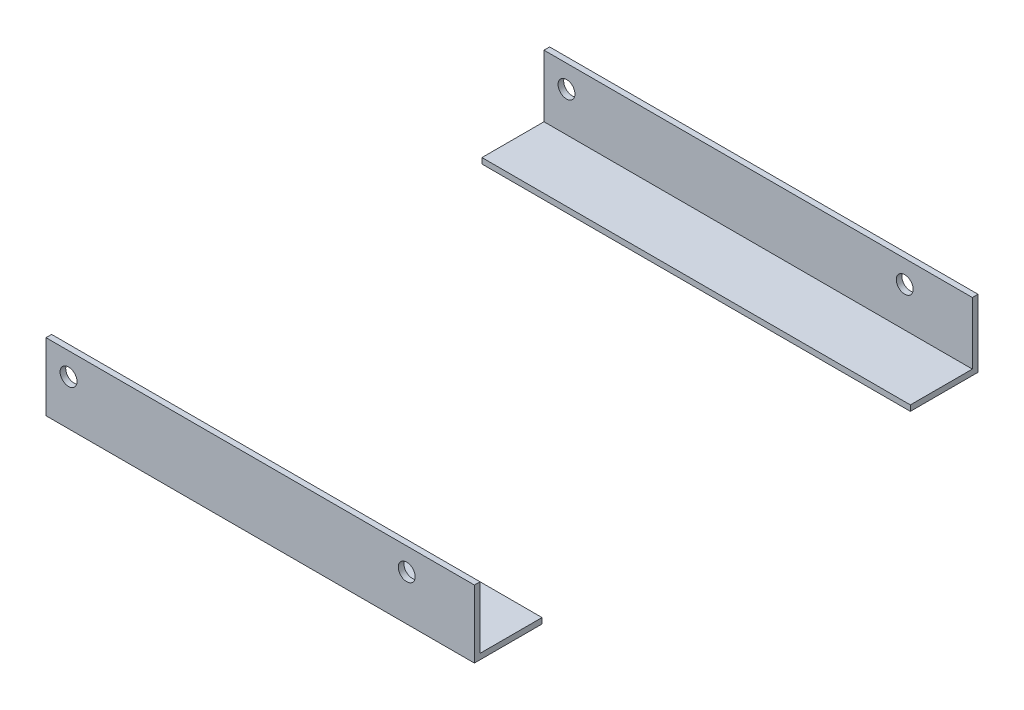
ISO-10303-21;
HEADER;
FILE_DESCRIPTION(('STEP AP214'),'2;1');
FILE_NAME('part.step','',(''),(''),'','','');
FILE_SCHEMA(('AUTOMOTIVE_DESIGN { 1 0 10303 214 1 1 1 1 }'));
ENDSEC;
DATA;
#1=APPLICATION_CONTEXT('core data for automotive mechanical design processes');
#2=APPLICATION_PROTOCOL_DEFINITION('international standard','automotive_design',2000,#1);
#3=PRODUCT_CONTEXT('',#1,'mechanical');
#4=PRODUCT('Part','Part','',(#3));
#5=PRODUCT_RELATED_PRODUCT_CATEGORY('part','',(#4));
#6=PRODUCT_DEFINITION_FORMATION('','',#4);
#7=PRODUCT_DEFINITION_CONTEXT('part definition',#1,'design');
#8=PRODUCT_DEFINITION('design','',#6,#7);
#9=PRODUCT_DEFINITION_SHAPE('','',#8);
#10=(LENGTH_UNIT() NAMED_UNIT(*) SI_UNIT(.MILLI.,.METRE.));
#11=(NAMED_UNIT(*) PLANE_ANGLE_UNIT() SI_UNIT($,.RADIAN.));
#12=(NAMED_UNIT(*) SI_UNIT($,.STERADIAN.) SOLID_ANGLE_UNIT());
#13=UNCERTAINTY_MEASURE_WITH_UNIT(LENGTH_MEASURE(1.E-05),#10,'distance_accuracy_value','');
#14=(GEOMETRIC_REPRESENTATION_CONTEXT(3) GLOBAL_UNCERTAINTY_ASSIGNED_CONTEXT((#13)) GLOBAL_UNIT_ASSIGNED_CONTEXT((#10,
#11,#12)) REPRESENTATION_CONTEXT('',''));
#15=CARTESIAN_POINT('',(0.,0.,0.));
#16=DIRECTION('',(0.,0.,1.));
#17=DIRECTION('',(1.,0.,0.));
#18=AXIS2_PLACEMENT_3D('',#15,#16,#17);
#19=CARTESIAN_POINT('',(-241.3,3.175,141.8336));
#20=DIRECTION('',(0.,0.,-1.));
#21=DIRECTION('',(-1.,0.,0.));
#22=AXIS2_PLACEMENT_3D('',#19,#20,#21);
#23=PLANE('',#22);
#24=CARTESIAN_POINT('',(-228.6,28.575,141.8336));
#25=DIRECTION('',(0.,0.,-1.));
#26=DIRECTION('',(-1.,0.,0.));
#27=AXIS2_PLACEMENT_3D('',#24,#25,#26);
#28=CIRCLE('',#27,4.76250000000001);
#29=CARTESIAN_POINT('',(-223.8375,28.575,141.8336));
#30=VERTEX_POINT('',#29);
#31=EDGE_CURVE('E144',#30,#30,#28,.T.);
#32=ORIENTED_EDGE('',*,*,#31,.T.);
#33=EDGE_LOOP('',(#32));
#34=FACE_BOUND('',#33,.T.);
#35=CARTESIAN_POINT('',(-38.1,28.575,141.8336));
#36=DIRECTION('',(0.,0.,-1.));
#37=DIRECTION('',(-1.,0.,0.));
#38=AXIS2_PLACEMENT_3D('',#35,#36,#37);
#39=CIRCLE('',#38,4.7625);
#40=CARTESIAN_POINT('',(-33.3375,28.575,141.8336));
#41=VERTEX_POINT('',#40);
#42=EDGE_CURVE('E127',#41,#41,#39,.T.);
#43=ORIENTED_EDGE('',*,*,#42,.T.);
#44=EDGE_LOOP('',(#43));
#45=FACE_BOUND('',#44,.T.);
#46=DIRECTION('',(0.,1.,0.));
#47=VECTOR('',#46,1.);
#48=CARTESIAN_POINT('',(0.,3.175,141.8336));
#49=LINE('',#48,#47);
#50=CARTESIAN_POINT('',(0.,3.175,141.8336));
#51=VERTEX_POINT('',#50);
#52=CARTESIAN_POINT('',(0.,41.275,141.8336));
#53=VERTEX_POINT('',#52);
#54=EDGE_CURVE('E93',#51,#53,#49,.T.);
#55=ORIENTED_EDGE('',*,*,#54,.T.);
#56=DIRECTION('',(1.,0.,0.));
#57=VECTOR('',#56,1.);
#58=CARTESIAN_POINT('',(-241.3,41.275,141.8336));
#59=LINE('',#58,#57);
#60=CARTESIAN_POINT('',(-241.3,41.275,141.8336));
#61=VERTEX_POINT('',#60);
#62=EDGE_CURVE('E139',#61,#53,#59,.T.);
#63=ORIENTED_EDGE('',*,*,#62,.F.);
#64=DIRECTION('',(0.,1.,0.));
#65=VECTOR('',#64,1.);
#66=CARTESIAN_POINT('',(-241.3,3.175,141.8336));
#67=LINE('',#66,#65);
#68=CARTESIAN_POINT('',(-241.3,3.175,141.8336));
#69=VERTEX_POINT('',#68);
#70=EDGE_CURVE('E112',#69,#61,#67,.T.);
#71=ORIENTED_EDGE('',*,*,#70,.F.);
#72=DIRECTION('',(1.,0.,0.));
#73=VECTOR('',#72,1.);
#74=CARTESIAN_POINT('',(-241.3,3.175,141.8336));
#75=LINE('',#74,#73);
#76=EDGE_CURVE('E126',#69,#51,#75,.T.);
#77=ORIENTED_EDGE('',*,*,#76,.T.);
#78=EDGE_LOOP('',(#55,#63,#71,#77));
#79=FACE_BOUND('',#78,.T.);
#80=ADVANCED_FACE('F44',(#34,#45,#79),#23,.F.);
#81=CARTESIAN_POINT('',(-241.3,41.275,138.6586));
#82=DIRECTION('',(0.,1.,0.));
#83=DIRECTION('',(0.,0.,1.));
#84=AXIS2_PLACEMENT_3D('',#81,#82,#83);
#85=PLANE('',#84);
#86=DIRECTION('',(0.,0.,1.));
#87=VECTOR('',#86,1.);
#88=CARTESIAN_POINT('',(0.,41.275,138.6586));
#89=LINE('',#88,#87);
#90=CARTESIAN_POINT('',(0.,41.275,138.6586));
#91=VERTEX_POINT('',#90);
#92=EDGE_CURVE('E123',#91,#53,#89,.T.);
#93=ORIENTED_EDGE('',*,*,#92,.F.);
#94=DIRECTION('',(1.,0.,0.));
#95=VECTOR('',#94,1.);
#96=CARTESIAN_POINT('',(-241.3,41.275,138.6586));
#97=LINE('',#96,#95);
#98=CARTESIAN_POINT('',(-241.3,41.275,138.6586));
#99=VERTEX_POINT('',#98);
#100=EDGE_CURVE('E135',#99,#91,#97,.T.);
#101=ORIENTED_EDGE('',*,*,#100,.F.);
#102=DIRECTION('',(0.,0.,1.));
#103=VECTOR('',#102,1.);
#104=CARTESIAN_POINT('',(-241.3,41.275,138.6586));
#105=LINE('',#104,#103);
#106=EDGE_CURVE('E140',#99,#61,#105,.T.);
#107=ORIENTED_EDGE('',*,*,#106,.T.);
#108=ORIENTED_EDGE('',*,*,#62,.T.);
#109=EDGE_LOOP('',(#93,#101,#107,#108));
#110=FACE_BOUND('',#109,.T.);
#111=ADVANCED_FACE('F165',(#110),#85,.T.);
#112=CARTESIAN_POINT('',(-241.3,3.175,138.6586));
#113=DIRECTION('',(0.,0.,-1.));
#114=DIRECTION('',(-1.,0.,0.));
#115=AXIS2_PLACEMENT_3D('',#112,#113,#114);
#116=PLANE('',#115);
#117=CARTESIAN_POINT('',(-228.6,28.575,138.6586));
#118=DIRECTION('',(0.,0.,-1.));
#119=DIRECTION('',(-1.,0.,0.));
#120=AXIS2_PLACEMENT_3D('',#117,#118,#119);
#121=CIRCLE('',#120,4.76250000000001);
#122=CARTESIAN_POINT('',(-223.8375,28.575,138.6586));
#123=VERTEX_POINT('',#122);
#124=EDGE_CURVE('E116',#123,#123,#121,.T.);
#125=ORIENTED_EDGE('',*,*,#124,.F.);
#126=EDGE_LOOP('',(#125));
#127=FACE_BOUND('',#126,.T.);
#128=CARTESIAN_POINT('',(-38.1,28.575,138.6586));
#129=DIRECTION('',(0.,0.,-1.));
#130=DIRECTION('',(-1.,0.,0.));
#131=AXIS2_PLACEMENT_3D('',#128,#129,#130);
#132=CIRCLE('',#131,4.7625);
#133=CARTESIAN_POINT('',(-33.3375,28.575,138.6586));
#134=VERTEX_POINT('',#133);
#135=EDGE_CURVE('E48',#134,#134,#132,.T.);
#136=ORIENTED_EDGE('',*,*,#135,.F.);
#137=EDGE_LOOP('',(#136));
#138=FACE_BOUND('',#137,.T.);
#139=DIRECTION('',(0.,1.,0.));
#140=VECTOR('',#139,1.);
#141=CARTESIAN_POINT('',(0.,3.175,138.6586));
#142=LINE('',#141,#140);
#143=CARTESIAN_POINT('',(0.,6.35,138.6586));
#144=VERTEX_POINT('',#143);
#145=EDGE_CURVE('E63',#144,#91,#142,.T.);
#146=ORIENTED_EDGE('',*,*,#145,.F.);
#147=DIRECTION('',(1.,0.,0.));
#148=VECTOR('',#147,1.);
#149=CARTESIAN_POINT('',(-241.3,6.35,138.6586));
#150=LINE('',#149,#148);
#151=CARTESIAN_POINT('',(-241.3,6.35,138.6586));
#152=VERTEX_POINT('',#151);
#153=EDGE_CURVE('E131',#152,#144,#150,.T.);
#154=ORIENTED_EDGE('',*,*,#153,.F.);
#155=DIRECTION('',(0.,1.,0.));
#156=VECTOR('',#155,1.);
#157=CARTESIAN_POINT('',(-241.3,3.175,138.6586));
#158=LINE('',#157,#156);
#159=EDGE_CURVE('E136',#152,#99,#158,.T.);
#160=ORIENTED_EDGE('',*,*,#159,.T.);
#161=ORIENTED_EDGE('',*,*,#100,.T.);
#162=EDGE_LOOP('',(#146,#154,#160,#161));
#163=FACE_BOUND('',#162,.T.);
#164=ADVANCED_FACE('F171',(#127,#138,#163),#116,.T.);
#165=CARTESIAN_POINT('',(-241.3,6.35,103.7336));
#166=DIRECTION('',(0.,1.,0.));
#167=DIRECTION('',(0.,0.,1.));
#168=AXIS2_PLACEMENT_3D('',#165,#166,#167);
#169=PLANE('',#168);
#170=DIRECTION('',(0.,0.,1.));
#171=VECTOR('',#170,1.);
#172=CARTESIAN_POINT('',(0.,6.35,103.7336));
#173=LINE('',#172,#171);
#174=CARTESIAN_POINT('',(0.,6.35,103.7336));
#175=VERTEX_POINT('',#174);
#176=EDGE_CURVE('E12',#175,#144,#173,.T.);
#177=ORIENTED_EDGE('',*,*,#176,.F.);
#178=DIRECTION('',(1.,0.,0.));
#179=VECTOR('',#178,1.);
#180=CARTESIAN_POINT('',(-241.3,6.35,103.7336));
#181=LINE('',#180,#179);
#182=CARTESIAN_POINT('',(-241.3,6.35,103.7336));
#183=VERTEX_POINT('',#182);
#184=EDGE_CURVE('E104',#183,#175,#181,.T.);
#185=ORIENTED_EDGE('',*,*,#184,.F.);
#186=DIRECTION('',(0.,0.,1.));
#187=VECTOR('',#186,1.);
#188=CARTESIAN_POINT('',(-241.3,6.35,103.7336));
#189=LINE('',#188,#187);
#190=EDGE_CURVE('E132',#183,#152,#189,.T.);
#191=ORIENTED_EDGE('',*,*,#190,.T.);
#192=ORIENTED_EDGE('',*,*,#153,.T.);
#193=EDGE_LOOP('',(#177,#185,#191,#192));
#194=FACE_BOUND('',#193,.T.);
#195=ADVANCED_FACE('F177',(#194),#169,.T.);
#196=CARTESIAN_POINT('',(-241.3,3.175,103.7336));
#197=DIRECTION('',(0.,0.,-1.));
#198=DIRECTION('',(-1.,0.,0.));
#199=AXIS2_PLACEMENT_3D('',#196,#197,#198);
#200=PLANE('',#199);
#201=DIRECTION('',(0.,1.,0.));
#202=VECTOR('',#201,1.);
#203=CARTESIAN_POINT('',(0.,3.175,103.7336));
#204=LINE('',#203,#202);
#205=CARTESIAN_POINT('',(0.,3.175,103.7336));
#206=VERTEX_POINT('',#205);
#207=EDGE_CURVE('E54',#206,#175,#204,.T.);
#208=ORIENTED_EDGE('',*,*,#207,.F.);
#209=DIRECTION('',(1.,0.,0.));
#210=VECTOR('',#209,1.);
#211=CARTESIAN_POINT('',(-241.3,3.175,103.7336));
#212=LINE('',#211,#210);
#213=CARTESIAN_POINT('',(-241.3,3.175,103.7336));
#214=VERTEX_POINT('',#213);
#215=EDGE_CURVE('E103',#214,#206,#212,.T.);
#216=ORIENTED_EDGE('',*,*,#215,.F.);
#217=DIRECTION('',(0.,1.,0.));
#218=VECTOR('',#217,1.);
#219=CARTESIAN_POINT('',(-241.3,3.175,103.7336));
#220=LINE('',#219,#218);
#221=EDGE_CURVE('E129',#214,#183,#220,.T.);
#222=ORIENTED_EDGE('',*,*,#221,.T.);
#223=ORIENTED_EDGE('',*,*,#184,.T.);
#224=EDGE_LOOP('',(#208,#216,#222,#223));
#225=FACE_BOUND('',#224,.T.);
#226=ADVANCED_FACE('F114',(#225),#200,.T.);
#227=CARTESIAN_POINT('',(-241.3,3.175,103.7336));
#228=DIRECTION('',(0.,1.,0.));
#229=DIRECTION('',(0.,0.,1.));
#230=AXIS2_PLACEMENT_3D('',#227,#228,#229);
#231=PLANE('',#230);
#232=DIRECTION('',(0.,0.,1.));
#233=VECTOR('',#232,1.);
#234=CARTESIAN_POINT('',(0.,3.175,103.7336));
#235=LINE('',#234,#233);
#236=EDGE_CURVE('E95',#206,#51,#235,.T.);
#237=ORIENTED_EDGE('',*,*,#236,.T.);
#238=ORIENTED_EDGE('',*,*,#76,.F.);
#239=DIRECTION('',(0.,0.,1.));
#240=VECTOR('',#239,1.);
#241=CARTESIAN_POINT('',(-241.3,3.175,103.7336));
#242=LINE('',#241,#240);
#243=EDGE_CURVE('E108',#214,#69,#242,.T.);
#244=ORIENTED_EDGE('',*,*,#243,.F.);
#245=ORIENTED_EDGE('',*,*,#215,.T.);
#246=EDGE_LOOP('',(#237,#238,#244,#245));
#247=FACE_BOUND('',#246,.T.);
#248=ADVANCED_FACE('F107',(#247),#231,.F.);
#249=CARTESIAN_POINT('',(-241.3,0.,0.));
#250=DIRECTION('',(1.,0.,0.));
#251=DIRECTION('',(0.,0.,-1.));
#252=AXIS2_PLACEMENT_3D('',#249,#250,#251);
#253=PLANE('',#252);
#254=ORIENTED_EDGE('',*,*,#70,.T.);
#255=ORIENTED_EDGE('',*,*,#106,.F.);
#256=ORIENTED_EDGE('',*,*,#159,.F.);
#257=ORIENTED_EDGE('',*,*,#190,.F.);
#258=ORIENTED_EDGE('',*,*,#221,.F.);
#259=ORIENTED_EDGE('',*,*,#243,.T.);
#260=EDGE_LOOP('',(#254,#255,#256,#257,#258,#259));
#261=FACE_BOUND('',#260,.T.);
#262=ADVANCED_FACE('F160',(#261),#253,.F.);
#263=CARTESIAN_POINT('',(0.,0.,0.));
#264=DIRECTION('',(1.,0.,0.));
#265=DIRECTION('',(0.,0.,-1.));
#266=AXIS2_PLACEMENT_3D('',#263,#264,#265);
#267=PLANE('',#266);
#268=ORIENTED_EDGE('',*,*,#92,.T.);
#269=ORIENTED_EDGE('',*,*,#54,.F.);
#270=ORIENTED_EDGE('',*,*,#236,.F.);
#271=ORIENTED_EDGE('',*,*,#207,.T.);
#272=ORIENTED_EDGE('',*,*,#176,.T.);
#273=ORIENTED_EDGE('',*,*,#145,.T.);
#274=EDGE_LOOP('',(#268,#269,#270,#271,#272,#273));
#275=FACE_BOUND('',#274,.T.);
#276=ADVANCED_FACE('F97',(#275),#267,.T.);
#277=CARTESIAN_POINT('',(-38.1,28.575,-190.5));
#278=DIRECTION('',(0.,0.,1.));
#279=DIRECTION('',(1.,0.,0.));
#280=AXIS2_PLACEMENT_3D('',#277,#278,#279);
#281=CYLINDRICAL_SURFACE('',#280,4.7625);
#282=CARTESIAN_POINT('',(-33.3375,28.575,138.6586));
#283=CARTESIAN_POINT('',(-33.3375,28.575,138.691672916667));
#284=CARTESIAN_POINT('',(-33.3375,28.575,138.724745833333));
#285=CARTESIAN_POINT('',(-33.3375,28.575,138.790891666667));
#286=CARTESIAN_POINT('',(-33.3375,28.575,138.823964583333));
#287=CARTESIAN_POINT('',(-33.3375,28.575,138.890110416667));
#288=CARTESIAN_POINT('',(-33.3375,28.575,138.923183333333));
#289=CARTESIAN_POINT('',(-33.3375,28.575,138.989329166667));
#290=CARTESIAN_POINT('',(-33.3375,28.575,139.022402083333));
#291=CARTESIAN_POINT('',(-33.3375,28.575,139.088547916667));
#292=CARTESIAN_POINT('',(-33.3375,28.575,139.121620833333));
#293=CARTESIAN_POINT('',(-33.3375,28.575,139.187766666667));
#294=CARTESIAN_POINT('',(-33.3375,28.575,139.220839583333));
#295=CARTESIAN_POINT('',(-33.3375,28.575,139.286985416667));
#296=CARTESIAN_POINT('',(-33.3375,28.575,139.320058333333));
#297=CARTESIAN_POINT('',(-33.3375,28.575,139.386204166667));
#298=CARTESIAN_POINT('',(-33.3375,28.575,139.419277083333));
#299=CARTESIAN_POINT('',(-33.3375,28.575,139.485422916667));
#300=CARTESIAN_POINT('',(-33.3375,28.575,139.518495833333));
#301=CARTESIAN_POINT('',(-33.3375,28.575,139.584641666667));
#302=CARTESIAN_POINT('',(-33.3375,28.575,139.617714583333));
#303=CARTESIAN_POINT('',(-33.3375,28.575,139.683860416667));
#304=CARTESIAN_POINT('',(-33.3375,28.575,139.716933333333));
#305=CARTESIAN_POINT('',(-33.3375,28.575,139.783079166667));
#306=CARTESIAN_POINT('',(-33.3375,28.575,139.816152083333));
#307=CARTESIAN_POINT('',(-33.3375,28.575,139.882297916667));
#308=CARTESIAN_POINT('',(-33.3375,28.575,139.915370833333));
#309=CARTESIAN_POINT('',(-33.3375,28.575,139.981516666667));
#310=CARTESIAN_POINT('',(-33.3375,28.575,140.014589583333));
#311=CARTESIAN_POINT('',(-33.3375,28.575,140.080735416667));
#312=CARTESIAN_POINT('',(-33.3375,28.575,140.113808333333));
#313=CARTESIAN_POINT('',(-33.3375,28.575,140.179954166667));
#314=CARTESIAN_POINT('',(-33.3375,28.575,140.213027083333));
#315=CARTESIAN_POINT('',(-33.3375,28.575,140.279172916667));
#316=CARTESIAN_POINT('',(-33.3375,28.575,140.312245833333));
#317=CARTESIAN_POINT('',(-33.3375,28.575,140.378391666667));
#318=CARTESIAN_POINT('',(-33.3375,28.575,140.411464583333));
#319=CARTESIAN_POINT('',(-33.3375,28.575,140.477610416667));
#320=CARTESIAN_POINT('',(-33.3375,28.575,140.510683333333));
#321=CARTESIAN_POINT('',(-33.3375,28.575,140.576829166667));
#322=CARTESIAN_POINT('',(-33.3375,28.575,140.609902083333));
#323=CARTESIAN_POINT('',(-33.3375,28.575,140.676047916667));
#324=CARTESIAN_POINT('',(-33.3375,28.575,140.709120833333));
#325=CARTESIAN_POINT('',(-33.3375,28.575,140.775266666667));
#326=CARTESIAN_POINT('',(-33.3375,28.575,140.808339583333));
#327=CARTESIAN_POINT('',(-33.3375,28.575,140.874485416667));
#328=CARTESIAN_POINT('',(-33.3375,28.575,140.907558333333));
#329=CARTESIAN_POINT('',(-33.3375,28.575,140.973704166667));
#330=CARTESIAN_POINT('',(-33.3375,28.575,141.006777083333));
#331=CARTESIAN_POINT('',(-33.3375,28.575,141.072922916667));
#332=CARTESIAN_POINT('',(-33.3375,28.575,141.105995833333));
#333=CARTESIAN_POINT('',(-33.3375,28.575,141.172141666667));
#334=CARTESIAN_POINT('',(-33.3375,28.575,141.205214583333));
#335=CARTESIAN_POINT('',(-33.3375,28.575,141.271360416667));
#336=CARTESIAN_POINT('',(-33.3375,28.575,141.304433333333));
#337=CARTESIAN_POINT('',(-33.3375,28.575,141.370579166667));
#338=CARTESIAN_POINT('',(-33.3375,28.575,141.403652083333));
#339=CARTESIAN_POINT('',(-33.3375,28.575,141.469797916667));
#340=CARTESIAN_POINT('',(-33.3375,28.575,141.502870833333));
#341=CARTESIAN_POINT('',(-33.3375,28.575,141.569016666667));
#342=CARTESIAN_POINT('',(-33.3375,28.575,141.602089583333));
#343=CARTESIAN_POINT('',(-33.3375,28.575,141.668235416667));
#344=CARTESIAN_POINT('',(-33.3375,28.575,141.701308333333));
#345=CARTESIAN_POINT('',(-33.3375,28.575,141.767454166667));
#346=CARTESIAN_POINT('',(-33.3375,28.575,141.800527083333));
#347=CARTESIAN_POINT('',(-33.3375,28.575,141.8336));
#348=B_SPLINE_CURVE_WITH_KNOTS('',3,(#282,#283,#284,#285,#286,#287,#288,#289,#290,#291,#292,
#293,#294,#295,#296,#297,#298,#299,#300,#301,#302,#303,#304,#305,#306,#307,#308,#309,#310,#311,
#312,#313,#314,#315,#316,#317,#318,#319,#320,#321,#322,#323,#324,#325,#326,#327,#328,#329,#330,
#331,#332,#333,#334,#335,#336,#337,#338,#339,#340,#341,#342,#343,#344,#345,#346,#347),
.UNSPECIFIED.,.F.,.F.,(4,2,2,2,2,2,2,2,2,2,2,2,2,2,2,2,2,2,2,2,2,2,2,2,2,2,2,2,2,2,2,2,4),(0.,
0.0992187500000186,0.198437499999982,0.29765625,0.396875000000019,0.496093749999982,0.5953125,
0.694531250000019,0.793750000000037,0.892968750000001,0.992187500000019,1.09140625000004,
1.190625,1.28984375000002,1.38906250000004,1.48828125,1.58750000000002,1.68671875000004,
1.7859375,1.88515625000002,1.98437500000004,2.08359375,2.18281250000002,2.28203125000004,
2.38125,2.48046875000002,2.57968750000004,2.67890625000006,2.77812500000002,2.87734375000004,
2.97656250000006,3.07578125000002,3.17500000000004),.UNSPECIFIED.);
#349=EDGE_CURVE('BSEAM151',#134,#41,#348,.T.);
#350=ORIENTED_EDGE('',*,*,#135,.T.);
#351=ORIENTED_EDGE('',*,*,#42,.F.);
#352=ORIENTED_EDGE('',*,*,#349,.T.);
#353=ORIENTED_EDGE('',*,*,#349,.F.);
#354=EDGE_LOOP('',(#350,#352,#351,#353));
#355=FACE_BOUND('',#354,.T.);
#356=ADVANCED_FACE('F151',(#355),#281,.F.);
#357=CARTESIAN_POINT('',(-228.6,28.575,-190.5));
#358=DIRECTION('',(0.,0.,1.));
#359=DIRECTION('',(1.,0.,0.));
#360=AXIS2_PLACEMENT_3D('',#357,#358,#359);
#361=CYLINDRICAL_SURFACE('',#360,4.76250000000001);
#362=CARTESIAN_POINT('',(-223.8375,28.575,138.6586));
#363=CARTESIAN_POINT('',(-223.8375,28.575,138.691672916667));
#364=CARTESIAN_POINT('',(-223.8375,28.575,138.724745833333));
#365=CARTESIAN_POINT('',(-223.8375,28.575,138.790891666667));
#366=CARTESIAN_POINT('',(-223.8375,28.575,138.823964583333));
#367=CARTESIAN_POINT('',(-223.8375,28.575,138.890110416667));
#368=CARTESIAN_POINT('',(-223.8375,28.575,138.923183333333));
#369=CARTESIAN_POINT('',(-223.8375,28.575,138.989329166667));
#370=CARTESIAN_POINT('',(-223.8375,28.575,139.022402083333));
#371=CARTESIAN_POINT('',(-223.8375,28.575,139.088547916667));
#372=CARTESIAN_POINT('',(-223.8375,28.575,139.121620833333));
#373=CARTESIAN_POINT('',(-223.8375,28.575,139.187766666667));
#374=CARTESIAN_POINT('',(-223.8375,28.575,139.220839583333));
#375=CARTESIAN_POINT('',(-223.8375,28.575,139.286985416667));
#376=CARTESIAN_POINT('',(-223.8375,28.575,139.320058333333));
#377=CARTESIAN_POINT('',(-223.8375,28.575,139.386204166667));
#378=CARTESIAN_POINT('',(-223.8375,28.575,139.419277083333));
#379=CARTESIAN_POINT('',(-223.8375,28.575,139.485422916667));
#380=CARTESIAN_POINT('',(-223.8375,28.575,139.518495833333));
#381=CARTESIAN_POINT('',(-223.8375,28.575,139.584641666667));
#382=CARTESIAN_POINT('',(-223.8375,28.575,139.617714583333));
#383=CARTESIAN_POINT('',(-223.8375,28.575,139.683860416667));
#384=CARTESIAN_POINT('',(-223.8375,28.575,139.716933333333));
#385=CARTESIAN_POINT('',(-223.8375,28.575,139.783079166667));
#386=CARTESIAN_POINT('',(-223.8375,28.575,139.816152083333));
#387=CARTESIAN_POINT('',(-223.8375,28.575,139.882297916667));
#388=CARTESIAN_POINT('',(-223.8375,28.575,139.915370833333));
#389=CARTESIAN_POINT('',(-223.8375,28.575,139.981516666667));
#390=CARTESIAN_POINT('',(-223.8375,28.575,140.014589583333));
#391=CARTESIAN_POINT('',(-223.8375,28.575,140.080735416667));
#392=CARTESIAN_POINT('',(-223.8375,28.575,140.113808333333));
#393=CARTESIAN_POINT('',(-223.8375,28.575,140.179954166667));
#394=CARTESIAN_POINT('',(-223.8375,28.575,140.213027083333));
#395=CARTESIAN_POINT('',(-223.8375,28.575,140.279172916667));
#396=CARTESIAN_POINT('',(-223.8375,28.575,140.312245833333));
#397=CARTESIAN_POINT('',(-223.8375,28.575,140.378391666667));
#398=CARTESIAN_POINT('',(-223.8375,28.575,140.411464583333));
#399=CARTESIAN_POINT('',(-223.8375,28.575,140.477610416667));
#400=CARTESIAN_POINT('',(-223.8375,28.575,140.510683333333));
#401=CARTESIAN_POINT('',(-223.8375,28.575,140.576829166667));
#402=CARTESIAN_POINT('',(-223.8375,28.575,140.609902083333));
#403=CARTESIAN_POINT('',(-223.8375,28.575,140.676047916667));
#404=CARTESIAN_POINT('',(-223.8375,28.575,140.709120833333));
#405=CARTESIAN_POINT('',(-223.8375,28.575,140.775266666667));
#406=CARTESIAN_POINT('',(-223.8375,28.575,140.808339583333));
#407=CARTESIAN_POINT('',(-223.8375,28.575,140.874485416667));
#408=CARTESIAN_POINT('',(-223.8375,28.575,140.907558333333));
#409=CARTESIAN_POINT('',(-223.8375,28.575,140.973704166667));
#410=CARTESIAN_POINT('',(-223.8375,28.575,141.006777083333));
#411=CARTESIAN_POINT('',(-223.8375,28.575,141.072922916667));
#412=CARTESIAN_POINT('',(-223.8375,28.575,141.105995833333));
#413=CARTESIAN_POINT('',(-223.8375,28.575,141.172141666667));
#414=CARTESIAN_POINT('',(-223.8375,28.575,141.205214583333));
#415=CARTESIAN_POINT('',(-223.8375,28.575,141.271360416667));
#416=CARTESIAN_POINT('',(-223.8375,28.575,141.304433333333));
#417=CARTESIAN_POINT('',(-223.8375,28.575,141.370579166667));
#418=CARTESIAN_POINT('',(-223.8375,28.575,141.403652083333));
#419=CARTESIAN_POINT('',(-223.8375,28.575,141.469797916667));
#420=CARTESIAN_POINT('',(-223.8375,28.575,141.502870833333));
#421=CARTESIAN_POINT('',(-223.8375,28.575,141.569016666667));
#422=CARTESIAN_POINT('',(-223.8375,28.575,141.602089583333));
#423=CARTESIAN_POINT('',(-223.8375,28.575,141.668235416667));
#424=CARTESIAN_POINT('',(-223.8375,28.575,141.701308333333));
#425=CARTESIAN_POINT('',(-223.8375,28.575,141.767454166667));
#426=CARTESIAN_POINT('',(-223.8375,28.575,141.800527083333));
#427=CARTESIAN_POINT('',(-223.8375,28.575,141.8336));
#428=B_SPLINE_CURVE_WITH_KNOTS('',3,(#362,#363,#364,#365,#366,#367,#368,#369,#370,#371,#372,
#373,#374,#375,#376,#377,#378,#379,#380,#381,#382,#383,#384,#385,#386,#387,#388,#389,#390,#391,
#392,#393,#394,#395,#396,#397,#398,#399,#400,#401,#402,#403,#404,#405,#406,#407,#408,#409,#410,
#411,#412,#413,#414,#415,#416,#417,#418,#419,#420,#421,#422,#423,#424,#425,#426,#427),
.UNSPECIFIED.,.F.,.F.,(4,2,2,2,2,2,2,2,2,2,2,2,2,2,2,2,2,2,2,2,2,2,2,2,2,2,2,2,2,2,2,2,4),(0.,
0.0992187500000186,0.198437499999982,0.29765625,0.396875000000019,0.496093749999982,0.5953125,
0.694531250000019,0.793750000000037,0.892968750000001,0.992187500000019,1.09140625000004,
1.190625,1.28984375000002,1.38906250000004,1.48828125,1.58750000000002,1.68671875000004,
1.7859375,1.88515625000002,1.98437500000004,2.08359375,2.18281250000002,2.28203125000004,
2.38125,2.48046875000002,2.57968750000004,2.67890625000006,2.77812500000002,2.87734375000004,
2.97656250000006,3.07578125000002,3.17500000000004),.UNSPECIFIED.);
#429=EDGE_CURVE('BSEAM46',#123,#30,#428,.T.);
#430=ORIENTED_EDGE('',*,*,#124,.T.);
#431=ORIENTED_EDGE('',*,*,#31,.F.);
#432=ORIENTED_EDGE('',*,*,#429,.T.);
#433=ORIENTED_EDGE('',*,*,#429,.F.);
#434=EDGE_LOOP('',(#430,#432,#431,#433));
#435=FACE_BOUND('',#434,.T.);
#436=ADVANCED_FACE('F46',(#435),#361,.F.);
#437=CLOSED_SHELL('',(#80,#111,#164,#195,#226,#248,#262,#276,#356,#436));
#438=MANIFOLD_SOLID_BREP('B2',#437);
#439=CARTESIAN_POINT('',(-241.3,41.2749999999999,-141.8336));
#440=DIRECTION('',(0.,1.,0.));
#441=DIRECTION('',(0.,0.,1.));
#442=AXIS2_PLACEMENT_3D('',#439,#440,#441);
#443=PLANE('',#442);
#444=DIRECTION('',(0.,0.,1.));
#445=VECTOR('',#444,1.);
#446=CARTESIAN_POINT('',(0.,41.2749999999999,-141.8336));
#447=LINE('',#446,#445);
#448=CARTESIAN_POINT('',(0.,41.2749999999999,-141.8336));
#449=VERTEX_POINT('',#448);
#450=CARTESIAN_POINT('',(0.,41.2749999999999,-138.6586));
#451=VERTEX_POINT('',#450);
#452=EDGE_CURVE('E350',#449,#451,#447,.T.);
#453=ORIENTED_EDGE('',*,*,#452,.F.);
#454=DIRECTION('',(1.,0.,0.));
#455=VECTOR('',#454,1.);
#456=CARTESIAN_POINT('',(-241.3,41.2749999999999,-141.8336));
#457=LINE('',#456,#455);
#458=CARTESIAN_POINT('',(-241.3,41.2749999999999,-141.8336));
#459=VERTEX_POINT('',#458);
#460=EDGE_CURVE('E330',#459,#449,#457,.T.);
#461=ORIENTED_EDGE('',*,*,#460,.F.);
#462=DIRECTION('',(0.,0.,1.));
#463=VECTOR('',#462,1.);
#464=CARTESIAN_POINT('',(-241.3,41.2749999999999,-141.8336));
#465=LINE('',#464,#463);
#466=CARTESIAN_POINT('',(-241.3,41.2749999999999,-138.6586));
#467=VERTEX_POINT('',#466);
#468=EDGE_CURVE('E334',#459,#467,#465,.T.);
#469=ORIENTED_EDGE('',*,*,#468,.T.);
#470=DIRECTION('',(1.,0.,0.));
#471=VECTOR('',#470,1.);
#472=CARTESIAN_POINT('',(-241.3,41.2749999999999,-138.6586));
#473=LINE('',#472,#471);
#474=EDGE_CURVE('E320',#467,#451,#473,.T.);
#475=ORIENTED_EDGE('',*,*,#474,.T.);
#476=EDGE_LOOP('',(#453,#461,#469,#475));
#477=FACE_BOUND('',#476,.T.);
#478=ADVANCED_FACE('F264',(#477),#443,.T.);
#479=CARTESIAN_POINT('',(-241.3,0.,0.));
#480=DIRECTION('',(1.,0.,0.));
#481=DIRECTION('',(0.,0.,-1.));
#482=AXIS2_PLACEMENT_3D('',#479,#480,#481);
#483=PLANE('',#482);
#484=DIRECTION('',(0.,0.,1.));
#485=VECTOR('',#484,1.);
#486=CARTESIAN_POINT('',(-241.3,3.17499999999997,-141.8336));
#487=LINE('',#486,#485);
#488=CARTESIAN_POINT('',(-241.3,3.17499999999997,-141.8336));
#489=VERTEX_POINT('',#488);
#490=CARTESIAN_POINT('',(-241.3,3.17499999999997,-103.7336));
#491=VERTEX_POINT('',#490);
#492=EDGE_CURVE('E307',#489,#491,#487,.T.);
#493=ORIENTED_EDGE('',*,*,#492,.T.);
#494=DIRECTION('',(0.,-1.,0.));
#495=VECTOR('',#494,1.);
#496=CARTESIAN_POINT('',(-241.3,6.34999999999997,-103.7336));
#497=LINE('',#496,#495);
#498=CARTESIAN_POINT('',(-241.3,6.34999999999997,-103.7336));
#499=VERTEX_POINT('',#498);
#500=EDGE_CURVE('E376',#499,#491,#497,.T.);
#501=ORIENTED_EDGE('',*,*,#500,.F.);
#502=DIRECTION('',(0.,0.,1.));
#503=VECTOR('',#502,1.);
#504=CARTESIAN_POINT('',(-241.3,6.34999999999997,-141.8336));
#505=LINE('',#504,#503);
#506=CARTESIAN_POINT('',(-241.3,6.34999999999997,-138.6586));
#507=VERTEX_POINT('',#506);
#508=EDGE_CURVE('E336',#507,#499,#505,.T.);
#509=ORIENTED_EDGE('',*,*,#508,.F.);
#510=DIRECTION('',(0.,1.,0.));
#511=VECTOR('',#510,1.);
#512=CARTESIAN_POINT('',(-241.3,3.17499999999997,-138.6586));
#513=LINE('',#512,#511);
#514=EDGE_CURVE('E324',#467,#507,#513,.F.);
#515=ORIENTED_EDGE('',*,*,#514,.F.);
#516=ORIENTED_EDGE('',*,*,#468,.F.);
#517=DIRECTION('',(0.,-1.,0.));
#518=VECTOR('',#517,1.);
#519=CARTESIAN_POINT('',(-241.3,3.17499999999997,-141.8336));
#520=LINE('',#519,#518);
#521=EDGE_CURVE('E283',#459,#489,#520,.T.);
#522=ORIENTED_EDGE('',*,*,#521,.T.);
#523=EDGE_LOOP('',(#493,#501,#509,#515,#516,#522));
#524=FACE_BOUND('',#523,.T.);
#525=ADVANCED_FACE('F333',(#524),#483,.F.);
#526=CARTESIAN_POINT('',(-38.1,28.575,-190.5));
#527=DIRECTION('',(0.,0.,1.));
#528=DIRECTION('',(1.,0.,0.));
#529=AXIS2_PLACEMENT_3D('',#526,#527,#528);
#530=CYLINDRICAL_SURFACE('',#529,4.7625);
#531=CARTESIAN_POINT('',(-38.1,28.575,-138.6586));
#532=DIRECTION('',(0.,0.,1.));
#533=DIRECTION('',(1.,0.,0.));
#534=AXIS2_PLACEMENT_3D('',#531,#532,#533);
#535=CIRCLE('',#534,4.7625);
#536=CARTESIAN_POINT('',(-33.3375,28.575,-138.6586));
#537=VERTEX_POINT('',#536);
#538=EDGE_CURVE('E364',#537,#537,#535,.T.);
#539=CARTESIAN_POINT('',(-38.1,28.575,-141.8336));
#540=DIRECTION('',(0.,0.,1.));
#541=DIRECTION('',(1.,0.,0.));
#542=AXIS2_PLACEMENT_3D('',#539,#540,#541);
#543=CIRCLE('',#542,4.7625);
#544=CARTESIAN_POINT('',(-33.3375,28.575,-141.8336));
#545=VERTEX_POINT('',#544);
#546=EDGE_CURVE('E362',#545,#545,#543,.T.);
#547=CARTESIAN_POINT('',(-33.3375,28.575,-138.6586));
#548=CARTESIAN_POINT('',(-33.3375,28.575,-138.691672916667));
#549=CARTESIAN_POINT('',(-33.3375,28.575,-138.724745833333));
#550=CARTESIAN_POINT('',(-33.3375,28.575,-138.790891666667));
#551=CARTESIAN_POINT('',(-33.3375,28.575,-138.823964583333));
#552=CARTESIAN_POINT('',(-33.3375,28.575,-138.890110416667));
#553=CARTESIAN_POINT('',(-33.3375,28.575,-138.923183333333));
#554=CARTESIAN_POINT('',(-33.3375,28.575,-138.989329166667));
#555=CARTESIAN_POINT('',(-33.3375,28.575,-139.022402083333));
#556=CARTESIAN_POINT('',(-33.3375,28.575,-139.088547916667));
#557=CARTESIAN_POINT('',(-33.3375,28.575,-139.121620833333));
#558=CARTESIAN_POINT('',(-33.3375,28.575,-139.187766666667));
#559=CARTESIAN_POINT('',(-33.3375,28.575,-139.220839583333));
#560=CARTESIAN_POINT('',(-33.3375,28.575,-139.286985416667));
#561=CARTESIAN_POINT('',(-33.3375,28.575,-139.320058333333));
#562=CARTESIAN_POINT('',(-33.3375,28.575,-139.386204166667));
#563=CARTESIAN_POINT('',(-33.3375,28.575,-139.419277083333));
#564=CARTESIAN_POINT('',(-33.3375,28.575,-139.485422916667));
#565=CARTESIAN_POINT('',(-33.3375,28.575,-139.518495833333));
#566=CARTESIAN_POINT('',(-33.3375,28.575,-139.584641666667));
#567=CARTESIAN_POINT('',(-33.3375,28.575,-139.617714583333));
#568=CARTESIAN_POINT('',(-33.3375,28.575,-139.683860416667));
#569=CARTESIAN_POINT('',(-33.3375,28.575,-139.716933333333));
#570=CARTESIAN_POINT('',(-33.3375,28.575,-139.783079166667));
#571=CARTESIAN_POINT('',(-33.3375,28.575,-139.816152083333));
#572=CARTESIAN_POINT('',(-33.3375,28.575,-139.882297916667));
#573=CARTESIAN_POINT('',(-33.3375,28.575,-139.915370833333));
#574=CARTESIAN_POINT('',(-33.3375,28.575,-139.981516666667));
#575=CARTESIAN_POINT('',(-33.3375,28.575,-140.014589583333));
#576=CARTESIAN_POINT('',(-33.3375,28.575,-140.080735416667));
#577=CARTESIAN_POINT('',(-33.3375,28.575,-140.113808333333));
#578=CARTESIAN_POINT('',(-33.3375,28.575,-140.179954166667));
#579=CARTESIAN_POINT('',(-33.3375,28.575,-140.213027083333));
#580=CARTESIAN_POINT('',(-33.3375,28.575,-140.279172916667));
#581=CARTESIAN_POINT('',(-33.3375,28.575,-140.312245833333));
#582=CARTESIAN_POINT('',(-33.3375,28.575,-140.378391666667));
#583=CARTESIAN_POINT('',(-33.3375,28.575,-140.411464583333));
#584=CARTESIAN_POINT('',(-33.3375,28.575,-140.477610416667));
#585=CARTESIAN_POINT('',(-33.3375,28.575,-140.510683333333));
#586=CARTESIAN_POINT('',(-33.3375,28.575,-140.576829166667));
#587=CARTESIAN_POINT('',(-33.3375,28.575,-140.609902083333));
#588=CARTESIAN_POINT('',(-33.3375,28.575,-140.676047916667));
#589=CARTESIAN_POINT('',(-33.3375,28.575,-140.709120833333));
#590=CARTESIAN_POINT('',(-33.3375,28.575,-140.775266666667));
#591=CARTESIAN_POINT('',(-33.3375,28.575,-140.808339583333));
#592=CARTESIAN_POINT('',(-33.3375,28.575,-140.874485416667));
#593=CARTESIAN_POINT('',(-33.3375,28.575,-140.907558333333));
#594=CARTESIAN_POINT('',(-33.3375,28.575,-140.973704166667));
#595=CARTESIAN_POINT('',(-33.3375,28.575,-141.006777083333));
#596=CARTESIAN_POINT('',(-33.3375,28.575,-141.072922916667));
#597=CARTESIAN_POINT('',(-33.3375,28.575,-141.105995833333));
#598=CARTESIAN_POINT('',(-33.3375,28.575,-141.172141666667));
#599=CARTESIAN_POINT('',(-33.3375,28.575,-141.205214583333));
#600=CARTESIAN_POINT('',(-33.3375,28.575,-141.271360416667));
#601=CARTESIAN_POINT('',(-33.3375,28.575,-141.304433333333));
#602=CARTESIAN_POINT('',(-33.3375,28.575,-141.370579166667));
#603=CARTESIAN_POINT('',(-33.3375,28.575,-141.403652083333));
#604=CARTESIAN_POINT('',(-33.3375,28.575,-141.469797916667));
#605=CARTESIAN_POINT('',(-33.3375,28.575,-141.502870833333));
#606=CARTESIAN_POINT('',(-33.3375,28.575,-141.569016666667));
#607=CARTESIAN_POINT('',(-33.3375,28.575,-141.602089583333));
#608=CARTESIAN_POINT('',(-33.3375,28.575,-141.668235416667));
#609=CARTESIAN_POINT('',(-33.3375,28.575,-141.701308333333));
#610=CARTESIAN_POINT('',(-33.3375,28.575,-141.767454166667));
#611=CARTESIAN_POINT('',(-33.3375,28.575,-141.800527083333));
#612=CARTESIAN_POINT('',(-33.3375,28.575,-141.8336));
#613=B_SPLINE_CURVE_WITH_KNOTS('',3,(#547,#548,#549,#550,#551,#552,#553,#554,#555,#556,#557,
#558,#559,#560,#561,#562,#563,#564,#565,#566,#567,#568,#569,#570,#571,#572,#573,#574,#575,#576,
#577,#578,#579,#580,#581,#582,#583,#584,#585,#586,#587,#588,#589,#590,#591,#592,#593,#594,#595,
#596,#597,#598,#599,#600,#601,#602,#603,#604,#605,#606,#607,#608,#609,#610,#611,#612),
.UNSPECIFIED.,.F.,.F.,(4,2,2,2,2,2,2,2,2,2,2,2,2,2,2,2,2,2,2,2,2,2,2,2,2,2,2,2,2,2,2,2,4),(0.,
0.0992187500000186,0.198437500000009,0.29765625,0.396875000000019,0.49609375000001,0.5953125,
0.694531250000019,0.79375000000001,0.892968750000001,0.992187500000019,1.09140625000001,
1.190625,1.28984375000002,1.38906250000001,1.48828125000003,1.58750000000002,1.68671875000001,
1.78593750000003,1.88515625000002,1.98437500000004,2.08359375000003,2.18281250000002,
2.28203125000004,2.38125000000003,2.48046875000002,2.57968750000004,2.67890625000003,
2.77812500000002,2.87734375000004,2.97656250000003,3.07578125000002,3.17500000000004),.UNSPECIFIED.);
#614=EDGE_CURVE('BSEAM402',#537,#545,#613,.T.);
#615=ORIENTED_EDGE('',*,*,#538,.T.);
#616=ORIENTED_EDGE('',*,*,#546,.F.);
#617=ORIENTED_EDGE('',*,*,#614,.T.);
#618=ORIENTED_EDGE('',*,*,#614,.F.);
#619=EDGE_LOOP('',(#615,#617,#616,#618));
#620=FACE_BOUND('',#619,.T.);
#621=ADVANCED_FACE('F402',(#620),#530,.F.);
#622=CARTESIAN_POINT('',(-228.6,28.575,-190.5));
#623=DIRECTION('',(0.,0.,1.));
#624=DIRECTION('',(1.,0.,0.));
#625=AXIS2_PLACEMENT_3D('',#622,#623,#624);
#626=CYLINDRICAL_SURFACE('',#625,4.76250000000001);
#627=CARTESIAN_POINT('',(-228.6,28.575,-138.6586));
#628=DIRECTION('',(0.,0.,1.));
#629=DIRECTION('',(1.,0.,0.));
#630=AXIS2_PLACEMENT_3D('',#627,#628,#629);
#631=CIRCLE('',#630,4.76250000000001);
#632=CARTESIAN_POINT('',(-223.8375,28.575,-138.6586));
#633=VERTEX_POINT('',#632);
#634=EDGE_CURVE('E345',#633,#633,#631,.T.);
#635=CARTESIAN_POINT('',(-228.6,28.575,-141.8336));
#636=DIRECTION('',(0.,0.,1.));
#637=DIRECTION('',(1.,0.,0.));
#638=AXIS2_PLACEMENT_3D('',#635,#636,#637);
#639=CIRCLE('',#638,4.76250000000001);
#640=CARTESIAN_POINT('',(-223.8375,28.575,-141.8336));
#641=VERTEX_POINT('',#640);
#642=EDGE_CURVE('E268',#641,#641,#639,.T.);
#643=CARTESIAN_POINT('',(-223.8375,28.575,-138.6586));
#644=CARTESIAN_POINT('',(-223.8375,28.575,-138.691672916667));
#645=CARTESIAN_POINT('',(-223.8375,28.575,-138.724745833333));
#646=CARTESIAN_POINT('',(-223.8375,28.575,-138.790891666667));
#647=CARTESIAN_POINT('',(-223.8375,28.575,-138.823964583333));
#648=CARTESIAN_POINT('',(-223.8375,28.575,-138.890110416667));
#649=CARTESIAN_POINT('',(-223.8375,28.575,-138.923183333333));
#650=CARTESIAN_POINT('',(-223.8375,28.575,-138.989329166667));
#651=CARTESIAN_POINT('',(-223.8375,28.575,-139.022402083333));
#652=CARTESIAN_POINT('',(-223.8375,28.575,-139.088547916667));
#653=CARTESIAN_POINT('',(-223.8375,28.575,-139.121620833333));
#654=CARTESIAN_POINT('',(-223.8375,28.575,-139.187766666667));
#655=CARTESIAN_POINT('',(-223.8375,28.575,-139.220839583333));
#656=CARTESIAN_POINT('',(-223.8375,28.575,-139.286985416667));
#657=CARTESIAN_POINT('',(-223.8375,28.575,-139.320058333333));
#658=CARTESIAN_POINT('',(-223.8375,28.575,-139.386204166667));
#659=CARTESIAN_POINT('',(-223.8375,28.575,-139.419277083333));
#660=CARTESIAN_POINT('',(-223.8375,28.575,-139.485422916667));
#661=CARTESIAN_POINT('',(-223.8375,28.575,-139.518495833333));
#662=CARTESIAN_POINT('',(-223.8375,28.575,-139.584641666667));
#663=CARTESIAN_POINT('',(-223.8375,28.575,-139.617714583333));
#664=CARTESIAN_POINT('',(-223.8375,28.575,-139.683860416667));
#665=CARTESIAN_POINT('',(-223.8375,28.575,-139.716933333333));
#666=CARTESIAN_POINT('',(-223.8375,28.575,-139.783079166667));
#667=CARTESIAN_POINT('',(-223.8375,28.575,-139.816152083333));
#668=CARTESIAN_POINT('',(-223.8375,28.575,-139.882297916667));
#669=CARTESIAN_POINT('',(-223.8375,28.575,-139.915370833333));
#670=CARTESIAN_POINT('',(-223.8375,28.575,-139.981516666667));
#671=CARTESIAN_POINT('',(-223.8375,28.575,-140.014589583333));
#672=CARTESIAN_POINT('',(-223.8375,28.575,-140.080735416667));
#673=CARTESIAN_POINT('',(-223.8375,28.575,-140.113808333333));
#674=CARTESIAN_POINT('',(-223.8375,28.575,-140.179954166667));
#675=CARTESIAN_POINT('',(-223.8375,28.575,-140.213027083333));
#676=CARTESIAN_POINT('',(-223.8375,28.575,-140.279172916667));
#677=CARTESIAN_POINT('',(-223.8375,28.575,-140.312245833333));
#678=CARTESIAN_POINT('',(-223.8375,28.575,-140.378391666667));
#679=CARTESIAN_POINT('',(-223.8375,28.575,-140.411464583333));
#680=CARTESIAN_POINT('',(-223.8375,28.575,-140.477610416667));
#681=CARTESIAN_POINT('',(-223.8375,28.575,-140.510683333333));
#682=CARTESIAN_POINT('',(-223.8375,28.575,-140.576829166667));
#683=CARTESIAN_POINT('',(-223.8375,28.575,-140.609902083333));
#684=CARTESIAN_POINT('',(-223.8375,28.575,-140.676047916667));
#685=CARTESIAN_POINT('',(-223.8375,28.575,-140.709120833333));
#686=CARTESIAN_POINT('',(-223.8375,28.575,-140.775266666667));
#687=CARTESIAN_POINT('',(-223.8375,28.575,-140.808339583333));
#688=CARTESIAN_POINT('',(-223.8375,28.575,-140.874485416667));
#689=CARTESIAN_POINT('',(-223.8375,28.575,-140.907558333333));
#690=CARTESIAN_POINT('',(-223.8375,28.575,-140.973704166667));
#691=CARTESIAN_POINT('',(-223.8375,28.575,-141.006777083333));
#692=CARTESIAN_POINT('',(-223.8375,28.575,-141.072922916667));
#693=CARTESIAN_POINT('',(-223.8375,28.575,-141.105995833333));
#694=CARTESIAN_POINT('',(-223.8375,28.575,-141.172141666667));
#695=CARTESIAN_POINT('',(-223.8375,28.575,-141.205214583333));
#696=CARTESIAN_POINT('',(-223.8375,28.575,-141.271360416667));
#697=CARTESIAN_POINT('',(-223.8375,28.575,-141.304433333333));
#698=CARTESIAN_POINT('',(-223.8375,28.575,-141.370579166667));
#699=CARTESIAN_POINT('',(-223.8375,28.575,-141.403652083333));
#700=CARTESIAN_POINT('',(-223.8375,28.575,-141.469797916667));
#701=CARTESIAN_POINT('',(-223.8375,28.575,-141.502870833333));
#702=CARTESIAN_POINT('',(-223.8375,28.575,-141.569016666667));
#703=CARTESIAN_POINT('',(-223.8375,28.575,-141.602089583333));
#704=CARTESIAN_POINT('',(-223.8375,28.575,-141.668235416667));
#705=CARTESIAN_POINT('',(-223.8375,28.575,-141.701308333333));
#706=CARTESIAN_POINT('',(-223.8375,28.575,-141.767454166667));
#707=CARTESIAN_POINT('',(-223.8375,28.575,-141.800527083333));
#708=CARTESIAN_POINT('',(-223.8375,28.575,-141.8336));
#709=B_SPLINE_CURVE_WITH_KNOTS('',3,(#643,#644,#645,#646,#647,#648,#649,#650,#651,#652,#653,
#654,#655,#656,#657,#658,#659,#660,#661,#662,#663,#664,#665,#666,#667,#668,#669,#670,#671,#672,
#673,#674,#675,#676,#677,#678,#679,#680,#681,#682,#683,#684,#685,#686,#687,#688,#689,#690,#691,
#692,#693,#694,#695,#696,#697,#698,#699,#700,#701,#702,#703,#704,#705,#706,#707,#708),
.UNSPECIFIED.,.F.,.F.,(4,2,2,2,2,2,2,2,2,2,2,2,2,2,2,2,2,2,2,2,2,2,2,2,2,2,2,2,2,2,2,2,4),(0.,
0.0992187500000186,0.198437500000009,0.29765625,0.396875000000019,0.49609375000001,0.5953125,
0.694531250000019,0.79375000000001,0.892968750000001,0.992187500000019,1.09140625000001,
1.190625,1.28984375000002,1.38906250000001,1.48828125000003,1.58750000000002,1.68671875000001,
1.78593750000003,1.88515625000002,1.98437500000004,2.08359375000003,2.18281250000002,
2.28203125000004,2.38125000000003,2.48046875000002,2.57968750000004,2.67890625000003,
2.77812500000002,2.87734375000004,2.97656250000003,3.07578125000002,3.17500000000004),.UNSPECIFIED.);
#710=EDGE_CURVE('BSEAM392',#633,#641,#709,.T.);
#711=ORIENTED_EDGE('',*,*,#634,.T.);
#712=ORIENTED_EDGE('',*,*,#642,.F.);
#713=ORIENTED_EDGE('',*,*,#710,.T.);
#714=ORIENTED_EDGE('',*,*,#710,.F.);
#715=EDGE_LOOP('',(#711,#713,#712,#714));
#716=FACE_BOUND('',#715,.T.);
#717=ADVANCED_FACE('F392',(#716),#626,.F.);
#718=CARTESIAN_POINT('',(-241.3,3.17499999999997,-141.8336));
#719=DIRECTION('',(0.,0.,1.));
#720=DIRECTION('',(1.,0.,0.));
#721=AXIS2_PLACEMENT_3D('',#718,#719,#720);
#722=PLANE('',#721);
#723=ORIENTED_EDGE('',*,*,#642,.T.);
#724=EDGE_LOOP('',(#723));
#725=FACE_BOUND('',#724,.T.);
#726=ORIENTED_EDGE('',*,*,#546,.T.);
#727=EDGE_LOOP('',(#726));
#728=FACE_BOUND('',#727,.T.);
#729=ORIENTED_EDGE('',*,*,#460,.T.);
#730=DIRECTION('',(0.,1.,0.));
#731=VECTOR('',#730,1.);
#732=CARTESIAN_POINT('',(0.,0.,-141.8336));
#733=LINE('',#732,#731);
#734=CARTESIAN_POINT('',(0.,3.17499999999997,-141.8336));
#735=VERTEX_POINT('',#734);
#736=EDGE_CURVE('E274',#735,#449,#733,.T.);
#737=ORIENTED_EDGE('',*,*,#736,.F.);
#738=DIRECTION('',(1.,0.,0.));
#739=VECTOR('',#738,1.);
#740=CARTESIAN_POINT('',(-241.3,3.17499999999997,-141.8336));
#741=LINE('',#740,#739);
#742=EDGE_CURVE('E339',#489,#735,#741,.T.);
#743=ORIENTED_EDGE('',*,*,#742,.F.);
#744=ORIENTED_EDGE('',*,*,#521,.F.);
#745=EDGE_LOOP('',(#729,#737,#743,#744));
#746=FACE_BOUND('',#745,.T.);
#747=ADVANCED_FACE('F390',(#725,#728,#746),#722,.F.);
#748=CARTESIAN_POINT('',(-241.3,3.17499999999997,-138.6586));
#749=DIRECTION('',(0.,0.,1.));
#750=DIRECTION('',(1.,0.,0.));
#751=AXIS2_PLACEMENT_3D('',#748,#749,#750);
#752=PLANE('',#751);
#753=ORIENTED_EDGE('',*,*,#634,.F.);
#754=EDGE_LOOP('',(#753));
#755=FACE_BOUND('',#754,.T.);
#756=ORIENTED_EDGE('',*,*,#538,.F.);
#757=EDGE_LOOP('',(#756));
#758=FACE_BOUND('',#757,.T.);
#759=DIRECTION('',(0.,1.,0.));
#760=VECTOR('',#759,1.);
#761=CARTESIAN_POINT('',(0.,0.,-138.6586));
#762=LINE('',#761,#760);
#763=CARTESIAN_POINT('',(0.,6.34999999999997,-138.6586));
#764=VERTEX_POINT('',#763);
#765=EDGE_CURVE('E42',#764,#451,#762,.T.);
#766=ORIENTED_EDGE('',*,*,#765,.T.);
#767=ORIENTED_EDGE('',*,*,#474,.F.);
#768=ORIENTED_EDGE('',*,*,#514,.T.);
#769=DIRECTION('',(1.,0.,0.));
#770=VECTOR('',#769,1.);
#771=CARTESIAN_POINT('',(-241.3,6.34999999999997,-138.6586));
#772=LINE('',#771,#770);
#773=EDGE_CURVE('E329',#507,#764,#772,.T.);
#774=ORIENTED_EDGE('',*,*,#773,.T.);
#775=EDGE_LOOP('',(#766,#767,#768,#774));
#776=FACE_BOUND('',#775,.T.);
#777=ADVANCED_FACE('F322',(#755,#758,#776),#752,.T.);
#778=CARTESIAN_POINT('',(-241.3,6.34999999999997,-141.8336));
#779=DIRECTION('',(0.,1.,0.));
#780=DIRECTION('',(0.,0.,1.));
#781=AXIS2_PLACEMENT_3D('',#778,#779,#780);
#782=PLANE('',#781);
#783=DIRECTION('',(0.,0.,1.));
#784=VECTOR('',#783,1.);
#785=CARTESIAN_POINT('',(0.,6.34999999999997,-141.8336));
#786=LINE('',#785,#784);
#787=CARTESIAN_POINT('',(0.,6.34999999999997,-103.7336));
#788=VERTEX_POINT('',#787);
#789=EDGE_CURVE('E347',#764,#788,#786,.T.);
#790=ORIENTED_EDGE('',*,*,#789,.F.);
#791=ORIENTED_EDGE('',*,*,#773,.F.);
#792=ORIENTED_EDGE('',*,*,#508,.T.);
#793=DIRECTION('',(1.,0.,0.));
#794=VECTOR('',#793,1.);
#795=CARTESIAN_POINT('',(-241.3,6.34999999999997,-103.7336));
#796=LINE('',#795,#794);
#797=EDGE_CURVE('E356',#499,#788,#796,.T.);
#798=ORIENTED_EDGE('',*,*,#797,.T.);
#799=EDGE_LOOP('',(#790,#791,#792,#798));
#800=FACE_BOUND('',#799,.T.);
#801=ADVANCED_FACE('F380',(#800),#782,.T.);
#802=CARTESIAN_POINT('',(-241.3,6.34999999999997,-103.7336));
#803=DIRECTION('',(0.,0.,1.));
#804=DIRECTION('',(1.,0.,0.));
#805=AXIS2_PLACEMENT_3D('',#802,#803,#804);
#806=PLANE('',#805);
#807=DIRECTION('',(0.,-1.,0.));
#808=VECTOR('',#807,1.);
#809=CARTESIAN_POINT('',(0.,6.34999999999997,-103.7336));
#810=LINE('',#809,#808);
#811=CARTESIAN_POINT('',(0.,3.17499999999997,-103.7336));
#812=VERTEX_POINT('',#811);
#813=EDGE_CURVE('E344',#788,#812,#810,.T.);
#814=ORIENTED_EDGE('',*,*,#813,.F.);
#815=ORIENTED_EDGE('',*,*,#797,.F.);
#816=ORIENTED_EDGE('',*,*,#500,.T.);
#817=DIRECTION('',(1.,0.,0.));
#818=VECTOR('',#817,1.);
#819=CARTESIAN_POINT('',(-241.3,3.17499999999997,-103.7336));
#820=LINE('',#819,#818);
#821=EDGE_CURVE('E359',#491,#812,#820,.T.);
#822=ORIENTED_EDGE('',*,*,#821,.T.);
#823=EDGE_LOOP('',(#814,#815,#816,#822));
#824=FACE_BOUND('',#823,.T.);
#825=ADVANCED_FACE('F387',(#824),#806,.T.);
#826=CARTESIAN_POINT('',(-241.3,3.17499999999997,-141.8336));
#827=DIRECTION('',(0.,1.,0.));
#828=DIRECTION('',(0.,0.,1.));
#829=AXIS2_PLACEMENT_3D('',#826,#827,#828);
#830=PLANE('',#829);
#831=DIRECTION('',(0.,0.,1.));
#832=VECTOR('',#831,1.);
#833=CARTESIAN_POINT('',(0.,3.17499999999997,-141.8336));
#834=LINE('',#833,#832);
#835=EDGE_CURVE('E302',#735,#812,#834,.T.);
#836=ORIENTED_EDGE('',*,*,#835,.T.);
#837=ORIENTED_EDGE('',*,*,#821,.F.);
#838=ORIENTED_EDGE('',*,*,#492,.F.);
#839=ORIENTED_EDGE('',*,*,#742,.T.);
#840=EDGE_LOOP('',(#836,#837,#838,#839));
#841=FACE_BOUND('',#840,.T.);
#842=ADVANCED_FACE('F266',(#841),#830,.F.);
#843=CARTESIAN_POINT('',(0.,0.,0.));
#844=DIRECTION('',(1.,0.,0.));
#845=DIRECTION('',(0.,0.,-1.));
#846=AXIS2_PLACEMENT_3D('',#843,#844,#845);
#847=PLANE('',#846);
#848=ORIENTED_EDGE('',*,*,#452,.T.);
#849=ORIENTED_EDGE('',*,*,#765,.F.);
#850=ORIENTED_EDGE('',*,*,#789,.T.);
#851=ORIENTED_EDGE('',*,*,#813,.T.);
#852=ORIENTED_EDGE('',*,*,#835,.F.);
#853=ORIENTED_EDGE('',*,*,#736,.T.);
#854=EDGE_LOOP('',(#848,#849,#850,#851,#852,#853));
#855=FACE_BOUND('',#854,.T.);
#856=ADVANCED_FACE('F385',(#855),#847,.T.);
#857=CLOSED_SHELL('',(#478,#525,#621,#717,#747,#777,#801,#825,#842,#856));
#858=MANIFOLD_SOLID_BREP('B6',#857);
#859=ADVANCED_BREP_SHAPE_REPRESENTATION('',(#18,#438,#858),#14);
#860=SHAPE_DEFINITION_REPRESENTATION(#9,#859);
ENDSEC;
END-ISO-10303-21;
